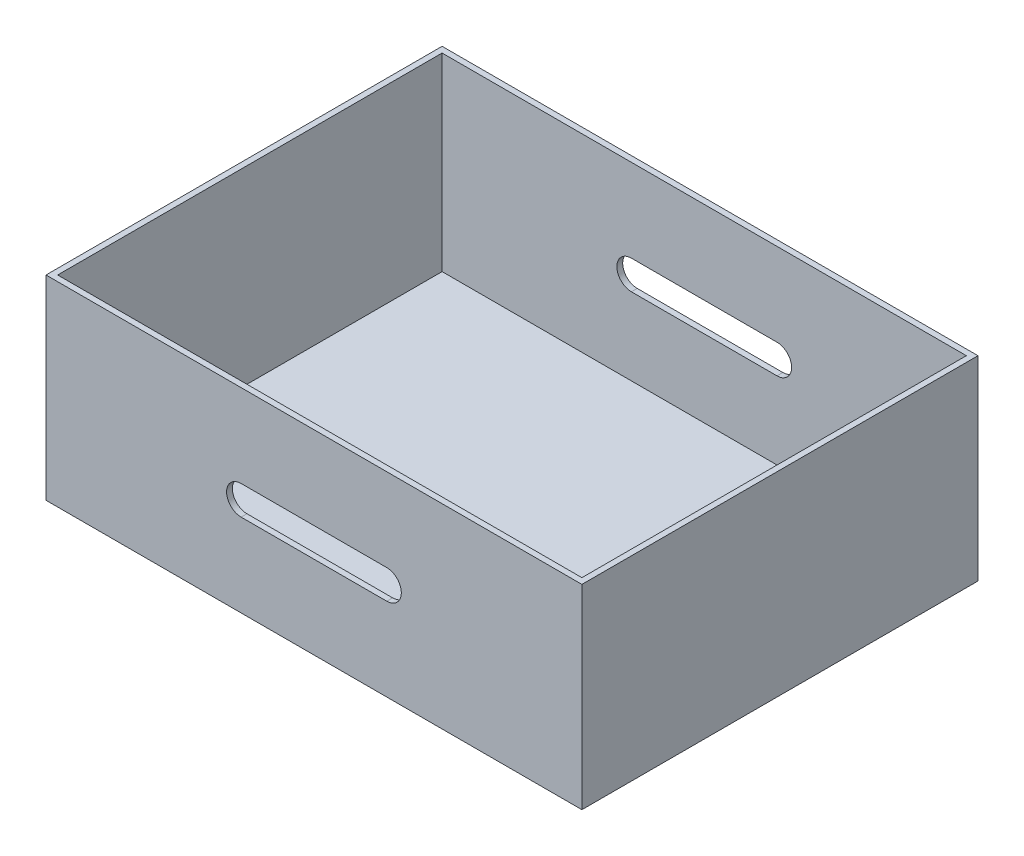
ISO-10303-21;
HEADER;
FILE_DESCRIPTION(('STEP AP214'),'2;1');
FILE_NAME('part.step','',(''),(''),'','','');
FILE_SCHEMA(('AUTOMOTIVE_DESIGN { 1 0 10303 214 1 1 1 1 }'));
ENDSEC;
DATA;
#1=APPLICATION_CONTEXT('core data for automotive mechanical design processes');
#2=APPLICATION_PROTOCOL_DEFINITION('international standard','automotive_design',2000,#1);
#3=PRODUCT_CONTEXT('',#1,'mechanical');
#4=PRODUCT('Part','Part','',(#3));
#5=PRODUCT_RELATED_PRODUCT_CATEGORY('part','',(#4));
#6=PRODUCT_DEFINITION_FORMATION('','',#4);
#7=PRODUCT_DEFINITION_CONTEXT('part definition',#1,'design');
#8=PRODUCT_DEFINITION('design','',#6,#7);
#9=PRODUCT_DEFINITION_SHAPE('','',#8);
#10=(LENGTH_UNIT() NAMED_UNIT(*) SI_UNIT(.MILLI.,.METRE.));
#11=(NAMED_UNIT(*) PLANE_ANGLE_UNIT() SI_UNIT($,.RADIAN.));
#12=(NAMED_UNIT(*) SI_UNIT($,.STERADIAN.) SOLID_ANGLE_UNIT());
#13=UNCERTAINTY_MEASURE_WITH_UNIT(LENGTH_MEASURE(1.E-05),#10,'distance_accuracy_value','');
#14=(GEOMETRIC_REPRESENTATION_CONTEXT(3) GLOBAL_UNCERTAINTY_ASSIGNED_CONTEXT((#13)) GLOBAL_UNIT_ASSIGNED_CONTEXT((#10,
#11,#12)) REPRESENTATION_CONTEXT('',''));
#15=CARTESIAN_POINT('',(0.,0.,0.));
#16=DIRECTION('',(0.,0.,1.));
#17=DIRECTION('',(1.,0.,0.));
#18=AXIS2_PLACEMENT_3D('',#15,#16,#17);
#19=CARTESIAN_POINT('',(92.,2.,68.));
#20=DIRECTION('',(-1.,0.,0.));
#21=DIRECTION('',(0.,0.,1.));
#22=AXIS2_PLACEMENT_3D('',#19,#20,#21);
#23=PLANE('',#22);
#24=DIRECTION('',(0.,0.,-1.));
#25=VECTOR('',#24,1.);
#26=CARTESIAN_POINT('',(92.,0.,68.));
#27=LINE('',#26,#25);
#28=CARTESIAN_POINT('',(92.,0.,68.));
#29=VERTEX_POINT('',#28);
#30=CARTESIAN_POINT('',(92.,0.,-68.));
#31=VERTEX_POINT('',#30);
#32=EDGE_CURVE('E271',#29,#31,#27,.T.);
#33=ORIENTED_EDGE('',*,*,#32,.T.);
#34=DIRECTION('',(0.,-1.,0.));
#35=VECTOR('',#34,1.);
#36=CARTESIAN_POINT('',(92.,2.,-68.));
#37=LINE('',#36,#35);
#38=CARTESIAN_POINT('',(92.,67.,-68.));
#39=VERTEX_POINT('',#38);
#40=EDGE_CURVE('E289',#39,#31,#37,.T.);
#41=ORIENTED_EDGE('',*,*,#40,.F.);
#42=DIRECTION('',(0.,0.,-1.));
#43=VECTOR('',#42,1.);
#44=CARTESIAN_POINT('',(92.,67.,0.));
#45=LINE('',#44,#43);
#46=CARTESIAN_POINT('',(92.,67.,68.));
#47=VERTEX_POINT('',#46);
#48=EDGE_CURVE('E259',#47,#39,#45,.T.);
#49=ORIENTED_EDGE('',*,*,#48,.F.);
#50=DIRECTION('',(0.,-1.,0.));
#51=VECTOR('',#50,1.);
#52=CARTESIAN_POINT('',(92.,2.,68.));
#53=LINE('',#52,#51);
#54=EDGE_CURVE('E280',#47,#29,#53,.T.);
#55=ORIENTED_EDGE('',*,*,#54,.T.);
#56=EDGE_LOOP('',(#33,#41,#49,#55));
#57=FACE_BOUND('',#56,.T.);
#58=ADVANCED_FACE('F63',(#57),#23,.F.);
#59=CARTESIAN_POINT('',(-92.,2.,-68.));
#60=DIRECTION('',(0.,0.,1.));
#61=DIRECTION('',(1.,0.,0.));
#62=AXIS2_PLACEMENT_3D('',#59,#60,#61);
#63=PLANE('',#62);
#64=DIRECTION('',(-1.,0.,0.));
#65=VECTOR('',#64,1.);
#66=CARTESIAN_POINT('',(-25.,38.5,-68.));
#67=LINE('',#66,#65);
#68=CARTESIAN_POINT('',(25.,38.5,-68.));
#69=VERTEX_POINT('',#68);
#70=CARTESIAN_POINT('',(-25.,38.5,-68.));
#71=VERTEX_POINT('',#70);
#72=EDGE_CURVE('E199',#69,#71,#67,.T.);
#73=ORIENTED_EDGE('',*,*,#72,.T.);
#74=CARTESIAN_POINT('',(-25.,33.5,-68.));
#75=DIRECTION('',(0.,0.,1.));
#76=DIRECTION('',(1.,0.,0.));
#77=AXIS2_PLACEMENT_3D('',#74,#75,#76);
#78=CIRCLE('',#77,5.);
#79=CARTESIAN_POINT('',(-25.,28.5,-68.));
#80=VERTEX_POINT('',#79);
#81=EDGE_CURVE('E181',#71,#80,#78,.T.);
#82=ORIENTED_EDGE('',*,*,#81,.T.);
#83=DIRECTION('',(1.,0.,0.));
#84=VECTOR('',#83,1.);
#85=CARTESIAN_POINT('',(-25.,28.5,-68.));
#86=LINE('',#85,#84);
#87=CARTESIAN_POINT('',(25.,28.5,-68.));
#88=VERTEX_POINT('',#87);
#89=EDGE_CURVE('E191',#80,#88,#86,.T.);
#90=ORIENTED_EDGE('',*,*,#89,.T.);
#91=CARTESIAN_POINT('',(25.,33.5,-68.));
#92=DIRECTION('',(0.,0.,1.));
#93=DIRECTION('',(1.,0.,0.));
#94=AXIS2_PLACEMENT_3D('',#91,#92,#93);
#95=CIRCLE('',#94,5.);
#96=EDGE_CURVE('E77',#88,#69,#95,.T.);
#97=ORIENTED_EDGE('',*,*,#96,.T.);
#98=EDGE_LOOP('',(#73,#82,#90,#97));
#99=FACE_BOUND('',#98,.T.);
#100=DIRECTION('',(-1.,0.,0.));
#101=VECTOR('',#100,1.);
#102=CARTESIAN_POINT('',(-92.,0.,-68.));
#103=LINE('',#102,#101);
#104=CARTESIAN_POINT('',(-92.,0.,-68.));
#105=VERTEX_POINT('',#104);
#106=EDGE_CURVE('E274',#31,#105,#103,.T.);
#107=ORIENTED_EDGE('',*,*,#106,.T.);
#108=DIRECTION('',(0.,-1.,0.));
#109=VECTOR('',#108,1.);
#110=CARTESIAN_POINT('',(-92.,2.,-68.));
#111=LINE('',#110,#109);
#112=CARTESIAN_POINT('',(-92.,67.,-68.));
#113=VERTEX_POINT('',#112);
#114=EDGE_CURVE('E286',#113,#105,#111,.T.);
#115=ORIENTED_EDGE('',*,*,#114,.F.);
#116=DIRECTION('',(-1.,0.,0.));
#117=VECTOR('',#116,1.);
#118=CARTESIAN_POINT('',(0.,67.,-68.));
#119=LINE('',#118,#117);
#120=EDGE_CURVE('E262',#39,#113,#119,.T.);
#121=ORIENTED_EDGE('',*,*,#120,.F.);
#122=ORIENTED_EDGE('',*,*,#40,.T.);
#123=EDGE_LOOP('',(#107,#115,#121,#122));
#124=FACE_BOUND('',#123,.T.);
#125=ADVANCED_FACE('F196',(#99,#124),#63,.F.);
#126=CARTESIAN_POINT('',(-92.,2.,68.));
#127=DIRECTION('',(1.,0.,0.));
#128=DIRECTION('',(0.,0.,-1.));
#129=AXIS2_PLACEMENT_3D('',#126,#127,#128);
#130=PLANE('',#129);
#131=DIRECTION('',(0.,0.,1.));
#132=VECTOR('',#131,1.);
#133=CARTESIAN_POINT('',(-92.,0.,68.));
#134=LINE('',#133,#132);
#135=CARTESIAN_POINT('',(-92.,0.,68.));
#136=VERTEX_POINT('',#135);
#137=EDGE_CURVE('E276',#105,#136,#134,.T.);
#138=ORIENTED_EDGE('',*,*,#137,.T.);
#139=DIRECTION('',(0.,-1.,0.));
#140=VECTOR('',#139,1.);
#141=CARTESIAN_POINT('',(-92.,2.,68.));
#142=LINE('',#141,#140);
#143=CARTESIAN_POINT('',(-92.,67.,68.));
#144=VERTEX_POINT('',#143);
#145=EDGE_CURVE('E283',#144,#136,#142,.T.);
#146=ORIENTED_EDGE('',*,*,#145,.F.);
#147=DIRECTION('',(0.,0.,1.));
#148=VECTOR('',#147,1.);
#149=CARTESIAN_POINT('',(-92.,67.,0.));
#150=LINE('',#149,#148);
#151=EDGE_CURVE('E265',#113,#144,#150,.T.);
#152=ORIENTED_EDGE('',*,*,#151,.F.);
#153=ORIENTED_EDGE('',*,*,#114,.T.);
#154=EDGE_LOOP('',(#138,#146,#152,#153));
#155=FACE_BOUND('',#154,.T.);
#156=ADVANCED_FACE('F320',(#155),#130,.F.);
#157=CARTESIAN_POINT('',(-92.,2.,68.));
#158=DIRECTION('',(0.,0.,-1.));
#159=DIRECTION('',(-1.,0.,0.));
#160=AXIS2_PLACEMENT_3D('',#157,#158,#159);
#161=PLANE('',#160);
#162=DIRECTION('',(1.,0.,0.));
#163=VECTOR('',#162,1.);
#164=CARTESIAN_POINT('',(-25.,28.5,68.));
#165=LINE('',#164,#163);
#166=CARTESIAN_POINT('',(-25.,28.5,68.));
#167=VERTEX_POINT('',#166);
#168=CARTESIAN_POINT('',(25.,28.5,68.));
#169=VERTEX_POINT('',#168);
#170=EDGE_CURVE('E209',#167,#169,#165,.T.);
#171=ORIENTED_EDGE('',*,*,#170,.F.);
#172=CARTESIAN_POINT('',(-25.,33.5,68.));
#173=DIRECTION('',(0.,0.,1.));
#174=DIRECTION('',(1.,0.,0.));
#175=AXIS2_PLACEMENT_3D('',#172,#173,#174);
#176=CIRCLE('',#175,5.);
#177=CARTESIAN_POINT('',(-25.,38.5,68.));
#178=VERTEX_POINT('',#177);
#179=EDGE_CURVE('E85',#178,#167,#176,.T.);
#180=ORIENTED_EDGE('',*,*,#179,.F.);
#181=DIRECTION('',(-1.,0.,0.));
#182=VECTOR('',#181,1.);
#183=CARTESIAN_POINT('',(-25.,38.5,68.));
#184=LINE('',#183,#182);
#185=CARTESIAN_POINT('',(25.,38.5,68.));
#186=VERTEX_POINT('',#185);
#187=EDGE_CURVE('E200',#186,#178,#184,.T.);
#188=ORIENTED_EDGE('',*,*,#187,.F.);
#189=CARTESIAN_POINT('',(25.,33.5,68.));
#190=DIRECTION('',(0.,0.,1.));
#191=DIRECTION('',(1.,0.,0.));
#192=AXIS2_PLACEMENT_3D('',#189,#190,#191);
#193=CIRCLE('',#192,5.);
#194=EDGE_CURVE('E203',#169,#186,#193,.T.);
#195=ORIENTED_EDGE('',*,*,#194,.F.);
#196=EDGE_LOOP('',(#171,#180,#188,#195));
#197=FACE_BOUND('',#196,.T.);
#198=DIRECTION('',(1.,0.,0.));
#199=VECTOR('',#198,1.);
#200=CARTESIAN_POINT('',(-92.,0.,68.));
#201=LINE('',#200,#199);
#202=EDGE_CURVE('E278',#136,#29,#201,.T.);
#203=ORIENTED_EDGE('',*,*,#202,.T.);
#204=ORIENTED_EDGE('',*,*,#54,.F.);
#205=DIRECTION('',(1.,0.,0.));
#206=VECTOR('',#205,1.);
#207=CARTESIAN_POINT('',(0.,67.,68.));
#208=LINE('',#207,#206);
#209=EDGE_CURVE('E268',#144,#47,#208,.T.);
#210=ORIENTED_EDGE('',*,*,#209,.F.);
#211=ORIENTED_EDGE('',*,*,#145,.T.);
#212=EDGE_LOOP('',(#203,#204,#210,#211));
#213=FACE_BOUND('',#212,.T.);
#214=ADVANCED_FACE('F316',(#197,#213),#161,.F.);
#215=CARTESIAN_POINT('',(0.,0.,0.));
#216=DIRECTION('',(0.,-1.,0.));
#217=DIRECTION('',(0.,0.,-1.));
#218=AXIS2_PLACEMENT_3D('',#215,#216,#217);
#219=PLANE('',#218);
#220=ORIENTED_EDGE('',*,*,#32,.F.);
#221=ORIENTED_EDGE('',*,*,#202,.F.);
#222=ORIENTED_EDGE('',*,*,#137,.F.);
#223=ORIENTED_EDGE('',*,*,#106,.F.);
#224=EDGE_LOOP('',(#220,#221,#222,#223));
#225=FACE_BOUND('',#224,.T.);
#226=ADVANCED_FACE('F319',(#225),#219,.T.);
#227=CARTESIAN_POINT('',(0.,67.,0.));
#228=DIRECTION('',(0.,1.,0.));
#229=DIRECTION('',(0.,0.,1.));
#230=AXIS2_PLACEMENT_3D('',#227,#228,#229);
#231=PLANE('',#230);
#232=ORIENTED_EDGE('',*,*,#48,.T.);
#233=ORIENTED_EDGE('',*,*,#120,.T.);
#234=ORIENTED_EDGE('',*,*,#151,.T.);
#235=ORIENTED_EDGE('',*,*,#209,.T.);
#236=EDGE_LOOP('',(#232,#233,#234,#235));
#237=FACE_BOUND('',#236,.T.);
#238=DIRECTION('',(-1.,0.,0.));
#239=VECTOR('',#238,1.);
#240=CARTESIAN_POINT('',(-90.,67.,-66.));
#241=LINE('',#240,#239);
#242=CARTESIAN_POINT('',(90.,67.,-66.));
#243=VERTEX_POINT('',#242);
#244=CARTESIAN_POINT('',(-90.,67.,-66.));
#245=VERTEX_POINT('',#244);
#246=EDGE_CURVE('E232',#243,#245,#241,.T.);
#247=ORIENTED_EDGE('',*,*,#246,.F.);
#248=DIRECTION('',(0.,0.,-1.));
#249=VECTOR('',#248,1.);
#250=CARTESIAN_POINT('',(90.,67.,66.));
#251=LINE('',#250,#249);
#252=CARTESIAN_POINT('',(90.,67.,66.));
#253=VERTEX_POINT('',#252);
#254=EDGE_CURVE('E230',#253,#243,#251,.T.);
#255=ORIENTED_EDGE('',*,*,#254,.F.);
#256=DIRECTION('',(1.,0.,0.));
#257=VECTOR('',#256,1.);
#258=CARTESIAN_POINT('',(-90.,67.,66.));
#259=LINE('',#258,#257);
#260=CARTESIAN_POINT('',(-90.,67.,66.));
#261=VERTEX_POINT('',#260);
#262=EDGE_CURVE('E238',#261,#253,#259,.T.);
#263=ORIENTED_EDGE('',*,*,#262,.F.);
#264=DIRECTION('',(0.,0.,1.));
#265=VECTOR('',#264,1.);
#266=CARTESIAN_POINT('',(-90.,67.,66.));
#267=LINE('',#266,#265);
#268=EDGE_CURVE('E235',#245,#261,#267,.T.);
#269=ORIENTED_EDGE('',*,*,#268,.F.);
#270=EDGE_LOOP('',(#247,#255,#263,#269));
#271=FACE_BOUND('',#270,.T.);
#272=ADVANCED_FACE('F332',(#237,#271),#231,.T.);
#273=CARTESIAN_POINT('',(90.,67.,66.));
#274=DIRECTION('',(-1.,0.,0.));
#275=DIRECTION('',(0.,0.,1.));
#276=AXIS2_PLACEMENT_3D('',#273,#274,#275);
#277=PLANE('',#276);
#278=DIRECTION('',(0.,0.,-1.));
#279=VECTOR('',#278,1.);
#280=CARTESIAN_POINT('',(90.,2.,66.));
#281=LINE('',#280,#279);
#282=CARTESIAN_POINT('',(90.,2.,66.));
#283=VERTEX_POINT('',#282);
#284=CARTESIAN_POINT('',(90.,2.,-66.));
#285=VERTEX_POINT('',#284);
#286=EDGE_CURVE('E229',#283,#285,#281,.T.);
#287=ORIENTED_EDGE('',*,*,#286,.F.);
#288=DIRECTION('',(0.,-1.,0.));
#289=VECTOR('',#288,1.);
#290=CARTESIAN_POINT('',(90.,67.,66.));
#291=LINE('',#290,#289);
#292=EDGE_CURVE('E240',#253,#283,#291,.T.);
#293=ORIENTED_EDGE('',*,*,#292,.F.);
#294=ORIENTED_EDGE('',*,*,#254,.T.);
#295=DIRECTION('',(0.,-1.,0.));
#296=VECTOR('',#295,1.);
#297=CARTESIAN_POINT('',(90.,67.,-66.));
#298=LINE('',#297,#296);
#299=EDGE_CURVE('E256',#243,#285,#298,.T.);
#300=ORIENTED_EDGE('',*,*,#299,.T.);
#301=EDGE_LOOP('',(#287,#293,#294,#300));
#302=FACE_BOUND('',#301,.T.);
#303=ADVANCED_FACE('F403',(#302),#277,.T.);
#304=CARTESIAN_POINT('',(-90.,67.,-66.));
#305=DIRECTION('',(0.,0.,1.));
#306=DIRECTION('',(1.,0.,0.));
#307=AXIS2_PLACEMENT_3D('',#304,#305,#306);
#308=PLANE('',#307);
#309=CARTESIAN_POINT('',(-25.,33.5,-66.));
#310=DIRECTION('',(0.,0.,1.));
#311=DIRECTION('',(1.,0.,0.));
#312=AXIS2_PLACEMENT_3D('',#309,#310,#311);
#313=CIRCLE('',#312,5.);
#314=CARTESIAN_POINT('',(-25.,38.5,-66.));
#315=VERTEX_POINT('',#314);
#316=CARTESIAN_POINT('',(-25.,28.5,-66.));
#317=VERTEX_POINT('',#316);
#318=EDGE_CURVE('E184',#315,#317,#313,.T.);
#319=ORIENTED_EDGE('',*,*,#318,.F.);
#320=DIRECTION('',(-1.,0.,0.));
#321=VECTOR('',#320,1.);
#322=CARTESIAN_POINT('',(-90.,38.5,-66.));
#323=LINE('',#322,#321);
#324=CARTESIAN_POINT('',(25.,38.5,-66.));
#325=VERTEX_POINT('',#324);
#326=EDGE_CURVE('E226',#325,#315,#323,.T.);
#327=ORIENTED_EDGE('',*,*,#326,.F.);
#328=CARTESIAN_POINT('',(25.,33.5,-66.));
#329=DIRECTION('',(0.,0.,1.));
#330=DIRECTION('',(1.,0.,0.));
#331=AXIS2_PLACEMENT_3D('',#328,#329,#330);
#332=CIRCLE('',#331,5.);
#333=CARTESIAN_POINT('',(25.,28.5,-66.));
#334=VERTEX_POINT('',#333);
#335=EDGE_CURVE('E224',#334,#325,#332,.T.);
#336=ORIENTED_EDGE('',*,*,#335,.F.);
#337=DIRECTION('',(1.,0.,0.));
#338=VECTOR('',#337,1.);
#339=CARTESIAN_POINT('',(-90.,28.5,-66.));
#340=LINE('',#339,#338);
#341=EDGE_CURVE('E216',#317,#334,#340,.T.);
#342=ORIENTED_EDGE('',*,*,#341,.F.);
#343=EDGE_LOOP('',(#319,#327,#336,#342));
#344=FACE_BOUND('',#343,.T.);
#345=DIRECTION('',(-1.,0.,0.));
#346=VECTOR('',#345,1.);
#347=CARTESIAN_POINT('',(-90.,2.,-66.));
#348=LINE('',#347,#346);
#349=CARTESIAN_POINT('',(-90.,2.,-66.));
#350=VERTEX_POINT('',#349);
#351=EDGE_CURVE('E243',#285,#350,#348,.T.);
#352=ORIENTED_EDGE('',*,*,#351,.F.);
#353=ORIENTED_EDGE('',*,*,#299,.F.);
#354=ORIENTED_EDGE('',*,*,#246,.T.);
#355=DIRECTION('',(0.,-1.,0.));
#356=VECTOR('',#355,1.);
#357=CARTESIAN_POINT('',(-90.,67.,-66.));
#358=LINE('',#357,#356);
#359=EDGE_CURVE('E254',#245,#350,#358,.T.);
#360=ORIENTED_EDGE('',*,*,#359,.T.);
#361=EDGE_LOOP('',(#352,#353,#354,#360));
#362=FACE_BOUND('',#361,.T.);
#363=ADVANCED_FACE('F398',(#344,#362),#308,.T.);
#364=CARTESIAN_POINT('',(-90.,67.,66.));
#365=DIRECTION('',(1.,0.,0.));
#366=DIRECTION('',(0.,0.,-1.));
#367=AXIS2_PLACEMENT_3D('',#364,#365,#366);
#368=PLANE('',#367);
#369=DIRECTION('',(0.,0.,1.));
#370=VECTOR('',#369,1.);
#371=CARTESIAN_POINT('',(-90.,2.,66.));
#372=LINE('',#371,#370);
#373=CARTESIAN_POINT('',(-90.,2.,66.));
#374=VERTEX_POINT('',#373);
#375=EDGE_CURVE('E246',#350,#374,#372,.T.);
#376=ORIENTED_EDGE('',*,*,#375,.F.);
#377=ORIENTED_EDGE('',*,*,#359,.F.);
#378=ORIENTED_EDGE('',*,*,#268,.T.);
#379=DIRECTION('',(0.,-1.,0.));
#380=VECTOR('',#379,1.);
#381=CARTESIAN_POINT('',(-90.,67.,66.));
#382=LINE('',#381,#380);
#383=EDGE_CURVE('E252',#261,#374,#382,.T.);
#384=ORIENTED_EDGE('',*,*,#383,.T.);
#385=EDGE_LOOP('',(#376,#377,#378,#384));
#386=FACE_BOUND('',#385,.T.);
#387=ADVANCED_FACE('F402',(#386),#368,.T.);
#388=CARTESIAN_POINT('',(-90.,67.,66.));
#389=DIRECTION('',(0.,0.,-1.));
#390=DIRECTION('',(-1.,0.,0.));
#391=AXIS2_PLACEMENT_3D('',#388,#389,#390);
#392=PLANE('',#391);
#393=CARTESIAN_POINT('',(-25.,33.5,66.));
#394=DIRECTION('',(0.,0.,-1.));
#395=DIRECTION('',(-1.,0.,0.));
#396=AXIS2_PLACEMENT_3D('',#393,#394,#395);
#397=CIRCLE('',#396,5.);
#398=CARTESIAN_POINT('',(-25.,28.5,66.));
#399=VERTEX_POINT('',#398);
#400=CARTESIAN_POINT('',(-25.,38.5,66.));
#401=VERTEX_POINT('',#400);
#402=EDGE_CURVE('E12',#399,#401,#397,.T.);
#403=ORIENTED_EDGE('',*,*,#402,.F.);
#404=DIRECTION('',(-1.,0.,0.));
#405=VECTOR('',#404,1.);
#406=CARTESIAN_POINT('',(-90.,28.5,66.));
#407=LINE('',#406,#405);
#408=CARTESIAN_POINT('',(25.,28.5,66.));
#409=VERTEX_POINT('',#408);
#410=EDGE_CURVE('E292',#409,#399,#407,.T.);
#411=ORIENTED_EDGE('',*,*,#410,.F.);
#412=CARTESIAN_POINT('',(25.,33.5,66.));
#413=DIRECTION('',(0.,0.,-1.));
#414=DIRECTION('',(-1.,0.,0.));
#415=AXIS2_PLACEMENT_3D('',#412,#413,#414);
#416=CIRCLE('',#415,5.);
#417=CARTESIAN_POINT('',(25.,38.5,66.));
#418=VERTEX_POINT('',#417);
#419=EDGE_CURVE('E294',#418,#409,#416,.T.);
#420=ORIENTED_EDGE('',*,*,#419,.F.);
#421=DIRECTION('',(1.,0.,0.));
#422=VECTOR('',#421,1.);
#423=CARTESIAN_POINT('',(-90.,38.5,66.));
#424=LINE('',#423,#422);
#425=EDGE_CURVE('E70',#401,#418,#424,.T.);
#426=ORIENTED_EDGE('',*,*,#425,.F.);
#427=EDGE_LOOP('',(#403,#411,#420,#426));
#428=FACE_BOUND('',#427,.T.);
#429=DIRECTION('',(1.,0.,0.));
#430=VECTOR('',#429,1.);
#431=CARTESIAN_POINT('',(-90.,2.,66.));
#432=LINE('',#431,#430);
#433=EDGE_CURVE('E233',#374,#283,#432,.T.);
#434=ORIENTED_EDGE('',*,*,#433,.F.);
#435=ORIENTED_EDGE('',*,*,#383,.F.);
#436=ORIENTED_EDGE('',*,*,#262,.T.);
#437=ORIENTED_EDGE('',*,*,#292,.T.);
#438=EDGE_LOOP('',(#434,#435,#436,#437));
#439=FACE_BOUND('',#438,.T.);
#440=ADVANCED_FACE('F309',(#428,#439),#392,.T.);
#441=CARTESIAN_POINT('',(0.,2.,0.));
#442=DIRECTION('',(0.,-1.,0.));
#443=DIRECTION('',(0.,0.,-1.));
#444=AXIS2_PLACEMENT_3D('',#441,#442,#443);
#445=PLANE('',#444);
#446=ORIENTED_EDGE('',*,*,#433,.T.);
#447=ORIENTED_EDGE('',*,*,#286,.T.);
#448=ORIENTED_EDGE('',*,*,#351,.T.);
#449=ORIENTED_EDGE('',*,*,#375,.T.);
#450=EDGE_LOOP('',(#446,#447,#448,#449));
#451=FACE_BOUND('',#450,.T.);
#452=ADVANCED_FACE('F359',(#451),#445,.F.);
#453=CARTESIAN_POINT('',(-25.,28.5,-68.));
#454=DIRECTION('',(0.,-1.,0.));
#455=DIRECTION('',(0.,0.,-1.));
#456=AXIS2_PLACEMENT_3D('',#453,#454,#455);
#457=PLANE('',#456);
#458=ORIENTED_EDGE('',*,*,#410,.T.);
#459=DIRECTION('',(0.,0.,1.));
#460=VECTOR('',#459,1.);
#461=CARTESIAN_POINT('',(-25.,28.5,-68.));
#462=LINE('',#461,#460);
#463=EDGE_CURVE('E188',#399,#167,#462,.T.);
#464=ORIENTED_EDGE('',*,*,#463,.T.);
#465=ORIENTED_EDGE('',*,*,#170,.T.);
#466=DIRECTION('',(0.,0.,1.));
#467=VECTOR('',#466,1.);
#468=CARTESIAN_POINT('',(25.,28.5,-68.));
#469=LINE('',#468,#467);
#470=EDGE_CURVE('E187',#409,#169,#469,.T.);
#471=ORIENTED_EDGE('',*,*,#470,.F.);
#472=EDGE_LOOP('',(#458,#464,#465,#471));
#473=FACE_BOUND('',#472,.T.);
#474=ADVANCED_FACE('F312',(#473),#457,.F.);
#475=CARTESIAN_POINT('',(25.,33.5,-68.));
#476=DIRECTION('',(0.,0.,1.));
#477=DIRECTION('',(1.,0.,0.));
#478=AXIS2_PLACEMENT_3D('',#475,#476,#477);
#479=CYLINDRICAL_SURFACE('',#478,5.);
#480=ORIENTED_EDGE('',*,*,#419,.T.);
#481=ORIENTED_EDGE('',*,*,#470,.T.);
#482=ORIENTED_EDGE('',*,*,#194,.T.);
#483=DIRECTION('',(0.,0.,1.));
#484=VECTOR('',#483,1.);
#485=CARTESIAN_POINT('',(25.,38.5,-68.));
#486=LINE('',#485,#484);
#487=EDGE_CURVE('E221',#418,#186,#486,.T.);
#488=ORIENTED_EDGE('',*,*,#487,.F.);
#489=EDGE_LOOP('',(#480,#481,#482,#488));
#490=FACE_BOUND('',#489,.T.);
#491=ADVANCED_FACE('F305',(#490),#479,.F.);
#492=CARTESIAN_POINT('',(-25.,38.5,-68.));
#493=DIRECTION('',(0.,1.,0.));
#494=DIRECTION('',(-1.,0.,0.));
#495=AXIS2_PLACEMENT_3D('',#492,#493,#494);
#496=PLANE('',#495);
#497=ORIENTED_EDGE('',*,*,#425,.T.);
#498=ORIENTED_EDGE('',*,*,#487,.T.);
#499=ORIENTED_EDGE('',*,*,#187,.T.);
#500=DIRECTION('',(0.,0.,1.));
#501=VECTOR('',#500,1.);
#502=CARTESIAN_POINT('',(-25.,38.5,-68.));
#503=LINE('',#502,#501);
#504=EDGE_CURVE('E217',#401,#178,#503,.T.);
#505=ORIENTED_EDGE('',*,*,#504,.F.);
#506=EDGE_LOOP('',(#497,#498,#499,#505));
#507=FACE_BOUND('',#506,.T.);
#508=ADVANCED_FACE('F300',(#507),#496,.F.);
#509=CARTESIAN_POINT('',(-25.,33.5,-68.));
#510=DIRECTION('',(0.,0.,1.));
#511=DIRECTION('',(1.,0.,0.));
#512=AXIS2_PLACEMENT_3D('',#509,#510,#511);
#513=CYLINDRICAL_SURFACE('',#512,5.);
#514=ORIENTED_EDGE('',*,*,#402,.T.);
#515=ORIENTED_EDGE('',*,*,#504,.T.);
#516=ORIENTED_EDGE('',*,*,#179,.T.);
#517=ORIENTED_EDGE('',*,*,#463,.F.);
#518=EDGE_LOOP('',(#514,#515,#516,#517));
#519=FACE_BOUND('',#518,.T.);
#520=ADVANCED_FACE('F314',(#519),#513,.F.);
#521=ORIENTED_EDGE('',*,*,#318,.T.);
#522=EDGE_CURVE('E176',#80,#317,#462,.T.);
#523=ORIENTED_EDGE('',*,*,#522,.F.);
#524=ORIENTED_EDGE('',*,*,#81,.F.);
#525=EDGE_CURVE('E214',#71,#315,#503,.T.);
#526=ORIENTED_EDGE('',*,*,#525,.T.);
#527=EDGE_LOOP('',(#521,#523,#524,#526));
#528=FACE_BOUND('',#527,.T.);
#529=ADVANCED_FACE('F178',(#528),#513,.F.);
#530=ORIENTED_EDGE('',*,*,#326,.T.);
#531=ORIENTED_EDGE('',*,*,#525,.F.);
#532=ORIENTED_EDGE('',*,*,#72,.F.);
#533=EDGE_CURVE('E218',#69,#325,#486,.T.);
#534=ORIENTED_EDGE('',*,*,#533,.T.);
#535=EDGE_LOOP('',(#530,#531,#532,#534));
#536=FACE_BOUND('',#535,.T.);
#537=ADVANCED_FACE('F437',(#536),#496,.F.);
#538=ORIENTED_EDGE('',*,*,#335,.T.);
#539=ORIENTED_EDGE('',*,*,#533,.F.);
#540=ORIENTED_EDGE('',*,*,#96,.F.);
#541=EDGE_CURVE('E193',#88,#334,#469,.T.);
#542=ORIENTED_EDGE('',*,*,#541,.T.);
#543=EDGE_LOOP('',(#538,#539,#540,#542));
#544=FACE_BOUND('',#543,.T.);
#545=ADVANCED_FACE('F429',(#544),#479,.F.);
#546=ORIENTED_EDGE('',*,*,#341,.T.);
#547=ORIENTED_EDGE('',*,*,#541,.F.);
#548=ORIENTED_EDGE('',*,*,#89,.F.);
#549=ORIENTED_EDGE('',*,*,#522,.T.);
#550=EDGE_LOOP('',(#546,#547,#548,#549));
#551=FACE_BOUND('',#550,.T.);
#552=ADVANCED_FACE('F192',(#551),#457,.F.);
#553=CLOSED_SHELL('',(#58,#125,#156,#214,#226,#272,#303,#363,#387,#440,#452,#474,#491,#508,#520,
#529,#537,#545,#552));
#554=MANIFOLD_SOLID_BREP('B2',#553);
#555=ADVANCED_BREP_SHAPE_REPRESENTATION('',(#18,#554),#14);
#556=SHAPE_DEFINITION_REPRESENTATION(#9,#555);
ENDSEC;
END-ISO-10303-21;
